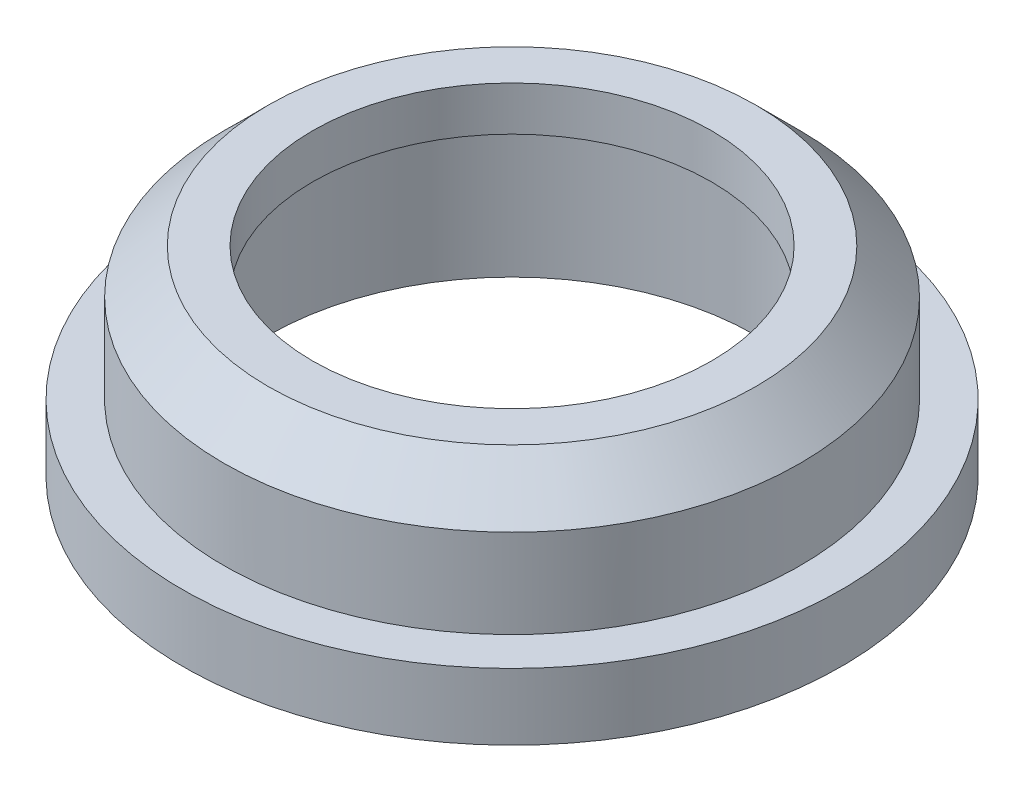
ISO-10303-21;
HEADER;
FILE_DESCRIPTION(('STEP AP214'),'2;1');
FILE_NAME('part.step','',(''),(''),'','','');
FILE_SCHEMA(('AUTOMOTIVE_DESIGN { 1 0 10303 214 1 1 1 1 }'));
ENDSEC;
DATA;
#1=APPLICATION_CONTEXT('core data for automotive mechanical design processes');
#2=APPLICATION_PROTOCOL_DEFINITION('international standard','automotive_design',2000,#1);
#3=PRODUCT_CONTEXT('',#1,'mechanical');
#4=PRODUCT('Part','Part','',(#3));
#5=PRODUCT_RELATED_PRODUCT_CATEGORY('part','',(#4));
#6=PRODUCT_DEFINITION_FORMATION('','',#4);
#7=PRODUCT_DEFINITION_CONTEXT('part definition',#1,'design');
#8=PRODUCT_DEFINITION('design','',#6,#7);
#9=PRODUCT_DEFINITION_SHAPE('','',#8);
#10=(LENGTH_UNIT() NAMED_UNIT(*) SI_UNIT(.MILLI.,.METRE.));
#11=(NAMED_UNIT(*) PLANE_ANGLE_UNIT() SI_UNIT($,.RADIAN.));
#12=(NAMED_UNIT(*) SI_UNIT($,.STERADIAN.) SOLID_ANGLE_UNIT());
#13=UNCERTAINTY_MEASURE_WITH_UNIT(LENGTH_MEASURE(1.E-05),#10,'distance_accuracy_value','');
#14=(GEOMETRIC_REPRESENTATION_CONTEXT(3) GLOBAL_UNCERTAINTY_ASSIGNED_CONTEXT((#13)) GLOBAL_UNIT_ASSIGNED_CONTEXT((#10,
#11,#12)) REPRESENTATION_CONTEXT('',''));
#15=CARTESIAN_POINT('',(0.,0.,0.));
#16=DIRECTION('',(0.,0.,1.));
#17=DIRECTION('',(1.,0.,0.));
#18=AXIS2_PLACEMENT_3D('',#15,#16,#17);
#19=CARTESIAN_POINT('',(0.,3.,0.));
#20=DIRECTION('',(0.,-1.,0.));
#21=DIRECTION('',(0.,0.,-1.));
#22=AXIS2_PLACEMENT_3D('',#19,#20,#21);
#23=PLANE('',#22);
#24=CARTESIAN_POINT('',(-50.1299429023961,3.,0.));
#25=DIRECTION('',(0.,-1.,0.));
#26=DIRECTION('',(0.,0.,-1.));
#27=AXIS2_PLACEMENT_3D('',#24,#25,#26);
#28=CIRCLE('',#27,13.);
#29=CARTESIAN_POINT('',(-50.1299429023961,3.,-13.));
#30=VERTEX_POINT('',#29);
#31=EDGE_CURVE('E52',#30,#30,#28,.F.);
#32=ORIENTED_EDGE('',*,*,#31,.F.);
#33=EDGE_LOOP('',(#32));
#34=FACE_BOUND('',#33,.T.);
#35=CARTESIAN_POINT('',(-50.1299429023961,3.,0.));
#36=DIRECTION('',(0.,-1.,0.));
#37=DIRECTION('',(0.,0.,-1.));
#38=AXIS2_PLACEMENT_3D('',#35,#36,#37);
#39=CIRCLE('',#38,14.8700570976039);
#40=CARTESIAN_POINT('',(-50.1299429023961,3.,-14.8700570976039));
#41=VERTEX_POINT('',#40);
#42=EDGE_CURVE('E68',#41,#41,#39,.F.);
#43=ORIENTED_EDGE('',*,*,#42,.T.);
#44=EDGE_LOOP('',(#43));
#45=FACE_BOUND('',#44,.T.);
#46=ADVANCED_FACE('F40',(#34,#45),#23,.F.);
#47=CARTESIAN_POINT('',(0.,0.,0.));
#48=DIRECTION('',(0.,-1.,0.));
#49=DIRECTION('',(0.,0.,-1.));
#50=AXIS2_PLACEMENT_3D('',#47,#48,#49);
#51=PLANE('',#50);
#52=CARTESIAN_POINT('',(-50.1299429023961,0.,0.));
#53=DIRECTION('',(0.,1.,0.));
#54=DIRECTION('',(0.,0.,1.));
#55=AXIS2_PLACEMENT_3D('',#52,#53,#54);
#56=CIRCLE('',#55,11.);
#57=CARTESIAN_POINT('',(-50.1299429023961,0.,11.));
#58=VERTEX_POINT('',#57);
#59=EDGE_CURVE('E56',#58,#58,#56,.T.);
#60=ORIENTED_EDGE('',*,*,#59,.T.);
#61=EDGE_LOOP('',(#60));
#62=FACE_BOUND('',#61,.T.);
#63=CARTESIAN_POINT('',(-50.1299429023961,0.,0.));
#64=DIRECTION('',(0.,-1.,0.));
#65=DIRECTION('',(0.,0.,-1.));
#66=AXIS2_PLACEMENT_3D('',#63,#64,#65);
#67=CIRCLE('',#66,14.8700570976039);
#68=CARTESIAN_POINT('',(-50.1299429023961,0.,-14.8700570976039));
#69=VERTEX_POINT('',#68);
#70=EDGE_CURVE('E73',#69,#69,#67,.F.);
#71=ORIENTED_EDGE('',*,*,#70,.F.);
#72=EDGE_LOOP('',(#71));
#73=FACE_BOUND('',#72,.T.);
#74=ADVANCED_FACE('F79',(#62,#73),#51,.T.);
#75=CARTESIAN_POINT('',(-50.1299429023961,3.,0.));
#76=DIRECTION('',(0.,-1.,0.));
#77=DIRECTION('',(0.,0.,-1.));
#78=AXIS2_PLACEMENT_3D('',#75,#76,#77);
#79=CYLINDRICAL_SURFACE('',#78,11.);
#80=ORIENTED_EDGE('',*,*,#59,.F.);
#81=EDGE_LOOP('',(#80));
#82=FACE_BOUND('',#81,.T.);
#83=CARTESIAN_POINT('',(-50.1299429023961,7.,0.));
#84=DIRECTION('',(0.,1.,0.));
#85=DIRECTION('',(0.,0.,1.));
#86=AXIS2_PLACEMENT_3D('',#83,#84,#85);
#87=CIRCLE('',#86,11.);
#88=CARTESIAN_POINT('',(-50.1299429023961,7.,11.));
#89=VERTEX_POINT('',#88);
#90=EDGE_CURVE('E61',#89,#89,#87,.T.);
#91=ORIENTED_EDGE('',*,*,#90,.T.);
#92=EDGE_LOOP('',(#91));
#93=FACE_BOUND('',#92,.T.);
#94=ADVANCED_FACE('F81',(#82,#93),#79,.F.);
#95=CARTESIAN_POINT('',(-50.1299429023961,7.,0.));
#96=DIRECTION('',(0.,-1.,0.));
#97=DIRECTION('',(0.,0.,-1.));
#98=AXIS2_PLACEMENT_3D('',#95,#96,#97);
#99=CYLINDRICAL_SURFACE('',#98,13.);
#100=CARTESIAN_POINT('',(-50.1299429023961,6.99999999999999,0.));
#101=DIRECTION('',(0.,1.,0.));
#102=DIRECTION('',(0.,0.,1.));
#103=AXIS2_PLACEMENT_3D('',#100,#101,#102);
#104=CIRCLE('',#103,13.);
#105=CARTESIAN_POINT('',(-50.1299429023961,6.99999999999999,13.));
#106=VERTEX_POINT('',#105);
#107=EDGE_CURVE('E11',#106,#106,#104,.F.);
#108=ORIENTED_EDGE('',*,*,#107,.T.);
#109=EDGE_LOOP('',(#108));
#110=FACE_BOUND('',#109,.T.);
#111=ORIENTED_EDGE('',*,*,#31,.T.);
#112=EDGE_LOOP('',(#111));
#113=FACE_BOUND('',#112,.T.);
#114=ADVANCED_FACE('F88',(#110,#113),#99,.T.);
#115=CARTESIAN_POINT('',(-50.1299429023961,7.,0.));
#116=DIRECTION('',(0.,1.,0.));
#117=DIRECTION('',(0.,0.,1.));
#118=AXIS2_PLACEMENT_3D('',#115,#116,#117);
#119=PLANE('',#118);
#120=CARTESIAN_POINT('',(-50.1299429023961,7.,0.));
#121=DIRECTION('',(0.,1.,0.));
#122=DIRECTION('',(0.,0.,1.));
#123=AXIS2_PLACEMENT_3D('',#120,#121,#122);
#124=CIRCLE('',#123,9.);
#125=CARTESIAN_POINT('',(-50.1299429023961,7.,9.));
#126=VERTEX_POINT('',#125);
#127=EDGE_CURVE('E65',#126,#126,#124,.T.);
#128=ORIENTED_EDGE('',*,*,#127,.T.);
#129=EDGE_LOOP('',(#128));
#130=FACE_BOUND('',#129,.T.);
#131=ORIENTED_EDGE('',*,*,#90,.F.);
#132=EDGE_LOOP('',(#131));
#133=FACE_BOUND('',#132,.T.);
#134=ADVANCED_FACE('F96',(#130,#133),#119,.F.);
#135=CARTESIAN_POINT('',(-50.1299429023961,9.,0.));
#136=DIRECTION('',(0.,1.,0.));
#137=DIRECTION('',(0.,0.,1.));
#138=AXIS2_PLACEMENT_3D('',#135,#136,#137);
#139=PLANE('',#138);
#140=CARTESIAN_POINT('',(-50.1299429023961,9.,0.));
#141=DIRECTION('',(0.,1.,0.));
#142=DIRECTION('',(0.,0.,1.));
#143=AXIS2_PLACEMENT_3D('',#140,#141,#142);
#144=CIRCLE('',#143,11.);
#145=CARTESIAN_POINT('',(-50.1299429023961,9.,11.));
#146=VERTEX_POINT('',#145);
#147=EDGE_CURVE('E48',#146,#146,#144,.T.);
#148=ORIENTED_EDGE('',*,*,#147,.T.);
#149=EDGE_LOOP('',(#148));
#150=FACE_BOUND('',#149,.T.);
#151=CARTESIAN_POINT('',(-50.1299429023961,9.,0.));
#152=DIRECTION('',(0.,1.,0.));
#153=DIRECTION('',(0.,0.,1.));
#154=AXIS2_PLACEMENT_3D('',#151,#152,#153);
#155=CIRCLE('',#154,9.);
#156=CARTESIAN_POINT('',(-50.1299429023961,9.,9.));
#157=VERTEX_POINT('',#156);
#158=EDGE_CURVE('E64',#157,#157,#155,.T.);
#159=ORIENTED_EDGE('',*,*,#158,.F.);
#160=EDGE_LOOP('',(#159));
#161=FACE_BOUND('',#160,.T.);
#162=ADVANCED_FACE('F99',(#150,#161),#139,.T.);
#163=CARTESIAN_POINT('',(-50.1299429023961,9.,0.));
#164=DIRECTION('',(0.,-1.,0.));
#165=DIRECTION('',(0.,0.,-1.));
#166=AXIS2_PLACEMENT_3D('',#163,#164,#165);
#167=CYLINDRICAL_SURFACE('',#166,9.);
#168=ORIENTED_EDGE('',*,*,#158,.T.);
#169=EDGE_LOOP('',(#168));
#170=FACE_BOUND('',#169,.T.);
#171=ORIENTED_EDGE('',*,*,#127,.F.);
#172=EDGE_LOOP('',(#171));
#173=FACE_BOUND('',#172,.T.);
#174=ADVANCED_FACE('F103',(#170,#173),#167,.F.);
#175=CARTESIAN_POINT('',(-50.1299429023961,9.,0.));
#176=DIRECTION('',(0.,-1.,0.));
#177=DIRECTION('',(0.,0.,-1.));
#178=AXIS2_PLACEMENT_3D('',#175,#176,#177);
#179=CONICAL_SURFACE('',#178,11.,0.785398163397447);
#180=ORIENTED_EDGE('',*,*,#107,.F.);
#181=EDGE_LOOP('',(#180));
#182=FACE_BOUND('',#181,.T.);
#183=ORIENTED_EDGE('',*,*,#147,.F.);
#184=EDGE_LOOP('',(#183));
#185=FACE_BOUND('',#184,.T.);
#186=ADVANCED_FACE('F43',(#182,#185),#179,.T.);
#187=CARTESIAN_POINT('',(-50.1299429023961,13.,0.));
#188=DIRECTION('',(0.,-1.,0.));
#189=DIRECTION('',(0.,0.,-1.));
#190=AXIS2_PLACEMENT_3D('',#187,#188,#189);
#191=CYLINDRICAL_SURFACE('',#190,14.8700570976039);
#192=ORIENTED_EDGE('',*,*,#42,.F.);
#193=EDGE_LOOP('',(#192));
#194=FACE_BOUND('',#193,.T.);
#195=ORIENTED_EDGE('',*,*,#70,.T.);
#196=EDGE_LOOP('',(#195));
#197=FACE_BOUND('',#196,.T.);
#198=ADVANCED_FACE('F77',(#194,#197),#191,.T.);
#199=CLOSED_SHELL('',(#46,#74,#94,#114,#134,#162,#174,#186,#198));
#200=MANIFOLD_SOLID_BREP('B2',#199);
#201=ADVANCED_BREP_SHAPE_REPRESENTATION('',(#18,#200),#14);
#202=SHAPE_DEFINITION_REPRESENTATION(#9,#201);
ENDSEC;
END-ISO-10303-21;
